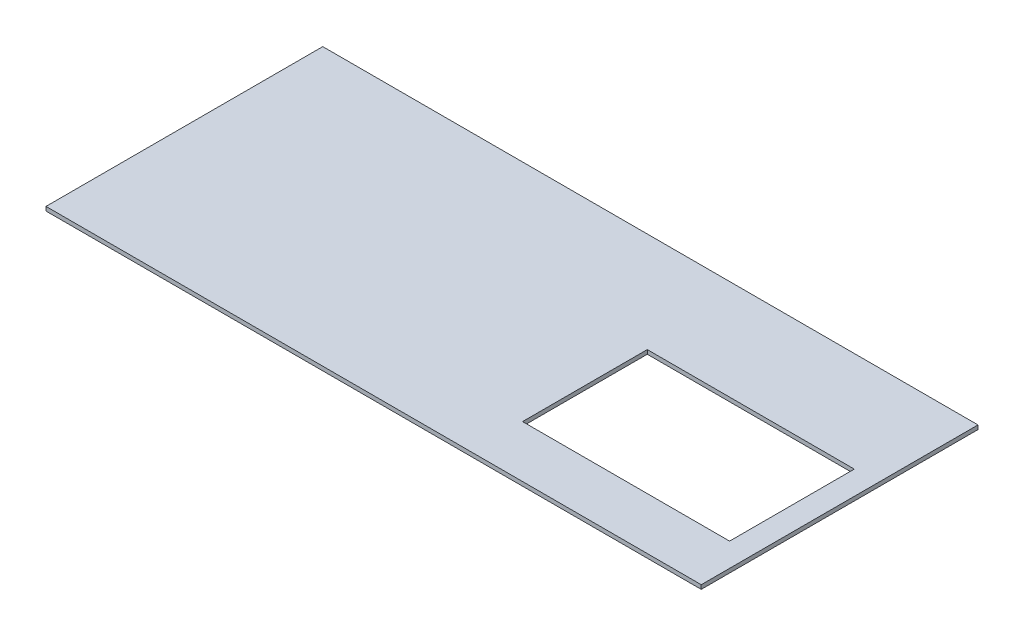
ISO-10303-21;
HEADER;
FILE_DESCRIPTION(('STEP AP214'),'2;1');
FILE_NAME('part.step','',(''),(''),'','','');
FILE_SCHEMA(('AUTOMOTIVE_DESIGN { 1 0 10303 214 1 1 1 1 }'));
ENDSEC;
DATA;
#1=APPLICATION_CONTEXT('core data for automotive mechanical design processes');
#2=APPLICATION_PROTOCOL_DEFINITION('international standard','automotive_design',2000,#1);
#3=PRODUCT_CONTEXT('',#1,'mechanical');
#4=PRODUCT('Part','Part','',(#3));
#5=PRODUCT_RELATED_PRODUCT_CATEGORY('part','',(#4));
#6=PRODUCT_DEFINITION_FORMATION('','',#4);
#7=PRODUCT_DEFINITION_CONTEXT('part definition',#1,'design');
#8=PRODUCT_DEFINITION('design','',#6,#7);
#9=PRODUCT_DEFINITION_SHAPE('','',#8);
#10=(LENGTH_UNIT() NAMED_UNIT(*) SI_UNIT(.MILLI.,.METRE.));
#11=(NAMED_UNIT(*) PLANE_ANGLE_UNIT() SI_UNIT($,.RADIAN.));
#12=(NAMED_UNIT(*) SI_UNIT($,.STERADIAN.) SOLID_ANGLE_UNIT());
#13=UNCERTAINTY_MEASURE_WITH_UNIT(LENGTH_MEASURE(1.E-05),#10,'distance_accuracy_value','');
#14=(GEOMETRIC_REPRESENTATION_CONTEXT(3) GLOBAL_UNCERTAINTY_ASSIGNED_CONTEXT((#13)) GLOBAL_UNIT_ASSIGNED_CONTEXT((#10,
#11,#12)) REPRESENTATION_CONTEXT('',''));
#15=CARTESIAN_POINT('',(0.,0.,0.));
#16=DIRECTION('',(0.,0.,1.));
#17=DIRECTION('',(1.,0.,0.));
#18=AXIS2_PLACEMENT_3D('',#15,#16,#17);
#19=CARTESIAN_POINT('',(-255.5875,3.175,107.95));
#20=DIRECTION('',(1.,0.,0.));
#21=DIRECTION('',(0.,0.,-1.));
#22=AXIS2_PLACEMENT_3D('',#19,#20,#21);
#23=PLANE('',#22);
#24=DIRECTION('',(0.,0.,1.));
#25=VECTOR('',#24,1.);
#26=CARTESIAN_POINT('',(-255.5875,0.,107.95));
#27=LINE('',#26,#25);
#28=CARTESIAN_POINT('',(-255.5875,0.,-107.95));
#29=VERTEX_POINT('',#28);
#30=CARTESIAN_POINT('',(-255.5875,0.,107.95));
#31=VERTEX_POINT('',#30);
#32=EDGE_CURVE('E130',#29,#31,#27,.T.);
#33=ORIENTED_EDGE('',*,*,#32,.T.);
#34=DIRECTION('',(0.,-1.,0.));
#35=VECTOR('',#34,1.);
#36=CARTESIAN_POINT('',(-255.5875,3.175,107.95));
#37=LINE('',#36,#35);
#38=CARTESIAN_POINT('',(-255.5875,3.175,107.95));
#39=VERTEX_POINT('',#38);
#40=EDGE_CURVE('E11',#39,#31,#37,.T.);
#41=ORIENTED_EDGE('',*,*,#40,.F.);
#42=DIRECTION('',(0.,0.,1.));
#43=VECTOR('',#42,1.);
#44=CARTESIAN_POINT('',(-255.5875,3.175,107.95));
#45=LINE('',#44,#43);
#46=CARTESIAN_POINT('',(-255.5875,3.175,-107.95));
#47=VERTEX_POINT('',#46);
#48=EDGE_CURVE('E134',#47,#39,#45,.T.);
#49=ORIENTED_EDGE('',*,*,#48,.F.);
#50=DIRECTION('',(0.,-1.,0.));
#51=VECTOR('',#50,1.);
#52=CARTESIAN_POINT('',(-255.5875,3.175,-107.95));
#53=LINE('',#52,#51);
#54=EDGE_CURVE('E144',#47,#29,#53,.T.);
#55=ORIENTED_EDGE('',*,*,#54,.T.);
#56=EDGE_LOOP('',(#33,#41,#49,#55));
#57=FACE_BOUND('',#56,.T.);
#58=ADVANCED_FACE('F33',(#57),#23,.F.);
#59=CARTESIAN_POINT('',(-255.5875,3.175,107.95));
#60=DIRECTION('',(0.,0.,-1.));
#61=DIRECTION('',(-1.,0.,0.));
#62=AXIS2_PLACEMENT_3D('',#59,#60,#61);
#63=PLANE('',#62);
#64=DIRECTION('',(1.,0.,0.));
#65=VECTOR('',#64,1.);
#66=CARTESIAN_POINT('',(-255.5875,0.,107.95));
#67=LINE('',#66,#65);
#68=CARTESIAN_POINT('',(255.5875,0.,107.95));
#69=VERTEX_POINT('',#68);
#70=EDGE_CURVE('E147',#31,#69,#67,.T.);
#71=ORIENTED_EDGE('',*,*,#70,.T.);
#72=DIRECTION('',(0.,-1.,0.));
#73=VECTOR('',#72,1.);
#74=CARTESIAN_POINT('',(255.5875,3.175,107.95));
#75=LINE('',#74,#73);
#76=CARTESIAN_POINT('',(255.5875,3.175,107.95));
#77=VERTEX_POINT('',#76);
#78=EDGE_CURVE('E40',#77,#69,#75,.T.);
#79=ORIENTED_EDGE('',*,*,#78,.F.);
#80=DIRECTION('',(1.,0.,0.));
#81=VECTOR('',#80,1.);
#82=CARTESIAN_POINT('',(-255.5875,3.175,107.95));
#83=LINE('',#82,#81);
#84=EDGE_CURVE('E137',#39,#77,#83,.T.);
#85=ORIENTED_EDGE('',*,*,#84,.F.);
#86=ORIENTED_EDGE('',*,*,#40,.T.);
#87=EDGE_LOOP('',(#71,#79,#85,#86));
#88=FACE_BOUND('',#87,.T.);
#89=ADVANCED_FACE('F175',(#88),#63,.F.);
#90=CARTESIAN_POINT('',(255.5875,3.175,107.95));
#91=DIRECTION('',(-1.,0.,0.));
#92=DIRECTION('',(0.,0.,1.));
#93=AXIS2_PLACEMENT_3D('',#90,#91,#92);
#94=PLANE('',#93);
#95=DIRECTION('',(0.,0.,-1.));
#96=VECTOR('',#95,1.);
#97=CARTESIAN_POINT('',(255.5875,0.,107.95));
#98=LINE('',#97,#96);
#99=CARTESIAN_POINT('',(255.5875,0.,-107.95));
#100=VERTEX_POINT('',#99);
#101=EDGE_CURVE('E149',#69,#100,#98,.T.);
#102=ORIENTED_EDGE('',*,*,#101,.T.);
#103=DIRECTION('',(0.,-1.,0.));
#104=VECTOR('',#103,1.);
#105=CARTESIAN_POINT('',(255.5875,3.175,-107.95));
#106=LINE('',#105,#104);
#107=CARTESIAN_POINT('',(255.5875,3.175,-107.95));
#108=VERTEX_POINT('',#107);
#109=EDGE_CURVE('E154',#108,#100,#106,.T.);
#110=ORIENTED_EDGE('',*,*,#109,.F.);
#111=DIRECTION('',(0.,0.,-1.));
#112=VECTOR('',#111,1.);
#113=CARTESIAN_POINT('',(255.5875,3.175,107.95));
#114=LINE('',#113,#112);
#115=EDGE_CURVE('E140',#77,#108,#114,.T.);
#116=ORIENTED_EDGE('',*,*,#115,.F.);
#117=ORIENTED_EDGE('',*,*,#78,.T.);
#118=EDGE_LOOP('',(#102,#110,#116,#117));
#119=FACE_BOUND('',#118,.T.);
#120=ADVANCED_FACE('F161',(#119),#94,.F.);
#121=CARTESIAN_POINT('',(-255.5875,3.175,-107.95));
#122=DIRECTION('',(0.,0.,1.));
#123=DIRECTION('',(1.,0.,0.));
#124=AXIS2_PLACEMENT_3D('',#121,#122,#123);
#125=PLANE('',#124);
#126=DIRECTION('',(-1.,0.,0.));
#127=VECTOR('',#126,1.);
#128=CARTESIAN_POINT('',(-255.5875,0.,-107.95));
#129=LINE('',#128,#127);
#130=EDGE_CURVE('E138',#100,#29,#129,.T.);
#131=ORIENTED_EDGE('',*,*,#130,.T.);
#132=ORIENTED_EDGE('',*,*,#54,.F.);
#133=DIRECTION('',(-1.,0.,0.));
#134=VECTOR('',#133,1.);
#135=CARTESIAN_POINT('',(-255.5875,3.175,-107.95));
#136=LINE('',#135,#134);
#137=EDGE_CURVE('E142',#108,#47,#136,.T.);
#138=ORIENTED_EDGE('',*,*,#137,.F.);
#139=ORIENTED_EDGE('',*,*,#109,.T.);
#140=EDGE_LOOP('',(#131,#132,#138,#139));
#141=FACE_BOUND('',#140,.T.);
#142=ADVANCED_FACE('F168',(#141),#125,.F.);
#143=CARTESIAN_POINT('',(0.,3.175,0.));
#144=DIRECTION('',(0.,-1.,0.));
#145=DIRECTION('',(0.,0.,-1.));
#146=AXIS2_PLACEMENT_3D('',#143,#144,#145);
#147=PLANE('',#146);
#148=DIRECTION('',(1.,0.,0.));
#149=VECTOR('',#148,1.);
#150=CARTESIAN_POINT('',(75.6875000000001,3.175,67.45));
#151=LINE('',#150,#149);
#152=CARTESIAN_POINT('',(75.6875000000001,3.175,67.45));
#153=VERTEX_POINT('',#152);
#154=CARTESIAN_POINT('',(237.1875,3.175,67.45));
#155=VERTEX_POINT('',#154);
#156=EDGE_CURVE('E124',#153,#155,#151,.T.);
#157=ORIENTED_EDGE('',*,*,#156,.F.);
#158=DIRECTION('',(0.,0.,1.));
#159=VECTOR('',#158,1.);
#160=CARTESIAN_POINT('',(75.6875000000001,3.175,67.45));
#161=LINE('',#160,#159);
#162=CARTESIAN_POINT('',(75.6875000000001,3.175,-29.85));
#163=VERTEX_POINT('',#162);
#164=EDGE_CURVE('E47',#163,#153,#161,.T.);
#165=ORIENTED_EDGE('',*,*,#164,.F.);
#166=DIRECTION('',(-1.,0.,0.));
#167=VECTOR('',#166,1.);
#168=CARTESIAN_POINT('',(75.6875000000001,3.175,-29.85));
#169=LINE('',#168,#167);
#170=CARTESIAN_POINT('',(237.1875,3.175,-29.85));
#171=VERTEX_POINT('',#170);
#172=EDGE_CURVE('E115',#171,#163,#169,.T.);
#173=ORIENTED_EDGE('',*,*,#172,.F.);
#174=DIRECTION('',(0.,0.,-1.));
#175=VECTOR('',#174,1.);
#176=CARTESIAN_POINT('',(237.1875,3.175,67.45));
#177=LINE('',#176,#175);
#178=EDGE_CURVE('E118',#155,#171,#177,.T.);
#179=ORIENTED_EDGE('',*,*,#178,.F.);
#180=EDGE_LOOP('',(#157,#165,#173,#179));
#181=FACE_BOUND('',#180,.T.);
#182=ORIENTED_EDGE('',*,*,#48,.T.);
#183=ORIENTED_EDGE('',*,*,#84,.T.);
#184=ORIENTED_EDGE('',*,*,#115,.T.);
#185=ORIENTED_EDGE('',*,*,#137,.T.);
#186=EDGE_LOOP('',(#182,#183,#184,#185));
#187=FACE_BOUND('',#186,.T.);
#188=ADVANCED_FACE('F174',(#181,#187),#147,.F.);
#189=CARTESIAN_POINT('',(0.,0.,0.));
#190=DIRECTION('',(0.,-1.,0.));
#191=DIRECTION('',(0.,0.,-1.));
#192=AXIS2_PLACEMENT_3D('',#189,#190,#191);
#193=PLANE('',#192);
#194=DIRECTION('',(0.,0.,1.));
#195=VECTOR('',#194,1.);
#196=CARTESIAN_POINT('',(75.6875000000001,0.,67.45));
#197=LINE('',#196,#195);
#198=CARTESIAN_POINT('',(75.6875000000001,0.,-29.85));
#199=VERTEX_POINT('',#198);
#200=CARTESIAN_POINT('',(75.6875000000001,0.,67.45));
#201=VERTEX_POINT('',#200);
#202=EDGE_CURVE('E99',#199,#201,#197,.T.);
#203=ORIENTED_EDGE('',*,*,#202,.T.);
#204=DIRECTION('',(1.,0.,0.));
#205=VECTOR('',#204,1.);
#206=CARTESIAN_POINT('',(75.6875000000001,0.,67.45));
#207=LINE('',#206,#205);
#208=CARTESIAN_POINT('',(237.1875,0.,67.45));
#209=VERTEX_POINT('',#208);
#210=EDGE_CURVE('E108',#201,#209,#207,.T.);
#211=ORIENTED_EDGE('',*,*,#210,.T.);
#212=DIRECTION('',(0.,0.,-1.));
#213=VECTOR('',#212,1.);
#214=CARTESIAN_POINT('',(237.1875,0.,67.45));
#215=LINE('',#214,#213);
#216=CARTESIAN_POINT('',(237.1875,0.,-29.85));
#217=VERTEX_POINT('',#216);
#218=EDGE_CURVE('E55',#209,#217,#215,.T.);
#219=ORIENTED_EDGE('',*,*,#218,.T.);
#220=DIRECTION('',(-1.,0.,0.));
#221=VECTOR('',#220,1.);
#222=CARTESIAN_POINT('',(75.6875000000001,0.,-29.85));
#223=LINE('',#222,#221);
#224=EDGE_CURVE('E105',#217,#199,#223,.T.);
#225=ORIENTED_EDGE('',*,*,#224,.T.);
#226=EDGE_LOOP('',(#203,#211,#219,#225));
#227=FACE_BOUND('',#226,.T.);
#228=ORIENTED_EDGE('',*,*,#32,.F.);
#229=ORIENTED_EDGE('',*,*,#130,.F.);
#230=ORIENTED_EDGE('',*,*,#101,.F.);
#231=ORIENTED_EDGE('',*,*,#70,.F.);
#232=EDGE_LOOP('',(#228,#229,#230,#231));
#233=FACE_BOUND('',#232,.T.);
#234=ADVANCED_FACE('F112',(#227,#233),#193,.T.);
#235=CARTESIAN_POINT('',(75.6875000000001,0.,67.45));
#236=DIRECTION('',(-1.,0.,0.));
#237=DIRECTION('',(0.,0.,1.));
#238=AXIS2_PLACEMENT_3D('',#235,#236,#237);
#239=PLANE('',#238);
#240=ORIENTED_EDGE('',*,*,#164,.T.);
#241=DIRECTION('',(0.,1.,0.));
#242=VECTOR('',#241,1.);
#243=CARTESIAN_POINT('',(75.6875000000001,0.,67.45));
#244=LINE('',#243,#242);
#245=EDGE_CURVE('E95',#201,#153,#244,.T.);
#246=ORIENTED_EDGE('',*,*,#245,.F.);
#247=ORIENTED_EDGE('',*,*,#202,.F.);
#248=DIRECTION('',(0.,1.,0.));
#249=VECTOR('',#248,1.);
#250=CARTESIAN_POINT('',(75.6875000000001,0.,-29.85));
#251=LINE('',#250,#249);
#252=EDGE_CURVE('E128',#199,#163,#251,.T.);
#253=ORIENTED_EDGE('',*,*,#252,.T.);
#254=EDGE_LOOP('',(#240,#246,#247,#253));
#255=FACE_BOUND('',#254,.T.);
#256=ADVANCED_FACE('F97',(#255),#239,.F.);
#257=CARTESIAN_POINT('',(75.6875000000001,0.,-29.85));
#258=DIRECTION('',(0.,0.,-1.));
#259=DIRECTION('',(-1.,0.,0.));
#260=AXIS2_PLACEMENT_3D('',#257,#258,#259);
#261=PLANE('',#260);
#262=ORIENTED_EDGE('',*,*,#172,.T.);
#263=ORIENTED_EDGE('',*,*,#252,.F.);
#264=ORIENTED_EDGE('',*,*,#224,.F.);
#265=DIRECTION('',(0.,1.,0.));
#266=VECTOR('',#265,1.);
#267=CARTESIAN_POINT('',(237.1875,0.,-29.85));
#268=LINE('',#267,#266);
#269=EDGE_CURVE('E131',#217,#171,#268,.T.);
#270=ORIENTED_EDGE('',*,*,#269,.T.);
#271=EDGE_LOOP('',(#262,#263,#264,#270));
#272=FACE_BOUND('',#271,.T.);
#273=ADVANCED_FACE('F192',(#272),#261,.F.);
#274=CARTESIAN_POINT('',(237.1875,0.,67.45));
#275=DIRECTION('',(1.,0.,0.));
#276=DIRECTION('',(0.,0.,-1.));
#277=AXIS2_PLACEMENT_3D('',#274,#275,#276);
#278=PLANE('',#277);
#279=ORIENTED_EDGE('',*,*,#178,.T.);
#280=ORIENTED_EDGE('',*,*,#269,.F.);
#281=ORIENTED_EDGE('',*,*,#218,.F.);
#282=DIRECTION('',(0.,1.,0.));
#283=VECTOR('',#282,1.);
#284=CARTESIAN_POINT('',(237.1875,0.,67.45));
#285=LINE('',#284,#283);
#286=EDGE_CURVE('E104',#209,#155,#285,.T.);
#287=ORIENTED_EDGE('',*,*,#286,.T.);
#288=EDGE_LOOP('',(#279,#280,#281,#287));
#289=FACE_BOUND('',#288,.T.);
#290=ADVANCED_FACE('F195',(#289),#278,.F.);
#291=CARTESIAN_POINT('',(75.6875000000001,0.,67.45));
#292=DIRECTION('',(0.,0.,1.));
#293=DIRECTION('',(1.,0.,0.));
#294=AXIS2_PLACEMENT_3D('',#291,#292,#293);
#295=PLANE('',#294);
#296=ORIENTED_EDGE('',*,*,#156,.T.);
#297=ORIENTED_EDGE('',*,*,#286,.F.);
#298=ORIENTED_EDGE('',*,*,#210,.F.);
#299=ORIENTED_EDGE('',*,*,#245,.T.);
#300=EDGE_LOOP('',(#296,#297,#298,#299));
#301=FACE_BOUND('',#300,.T.);
#302=ADVANCED_FACE('F109',(#301),#295,.F.);
#303=CLOSED_SHELL('',(#58,#89,#120,#142,#188,#234,#256,#273,#290,#302));
#304=MANIFOLD_SOLID_BREP('B2',#303);
#305=ADVANCED_BREP_SHAPE_REPRESENTATION('',(#18,#304),#14);
#306=SHAPE_DEFINITION_REPRESENTATION(#9,#305);
ENDSEC;
END-ISO-10303-21;
